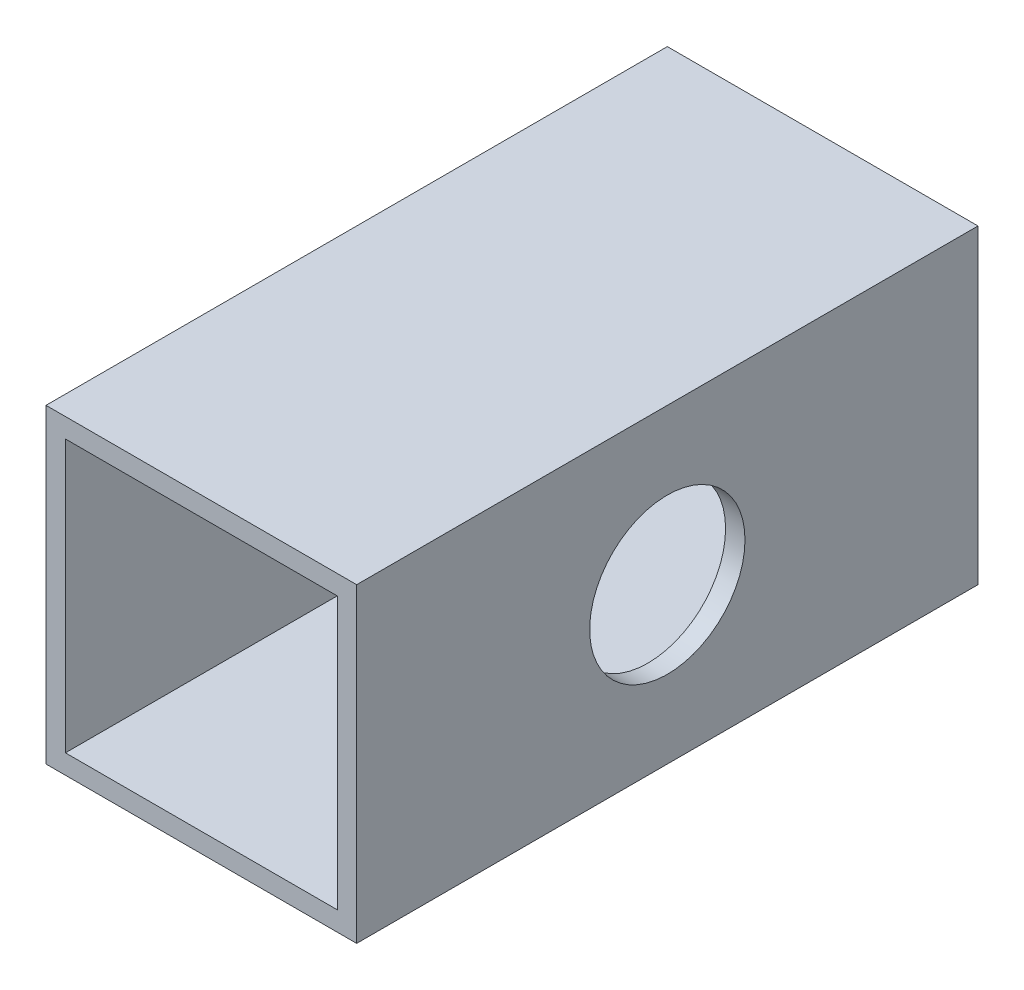
ISO-10303-21;
HEADER;
FILE_DESCRIPTION(('STEP AP214'),'2;1');
FILE_NAME('part.step','',(''),(''),'','','');
FILE_SCHEMA(('AUTOMOTIVE_DESIGN { 1 0 10303 214 1 1 1 1 }'));
ENDSEC;
DATA;
#1=APPLICATION_CONTEXT('core data for automotive mechanical design processes');
#2=APPLICATION_PROTOCOL_DEFINITION('international standard','automotive_design',2000,#1);
#3=PRODUCT_CONTEXT('',#1,'mechanical');
#4=PRODUCT('Part','Part','',(#3));
#5=PRODUCT_RELATED_PRODUCT_CATEGORY('part','',(#4));
#6=PRODUCT_DEFINITION_FORMATION('','',#4);
#7=PRODUCT_DEFINITION_CONTEXT('part definition',#1,'design');
#8=PRODUCT_DEFINITION('design','',#6,#7);
#9=PRODUCT_DEFINITION_SHAPE('','',#8);
#10=(LENGTH_UNIT() NAMED_UNIT(*) SI_UNIT(.MILLI.,.METRE.));
#11=(NAMED_UNIT(*) PLANE_ANGLE_UNIT() SI_UNIT($,.RADIAN.));
#12=(NAMED_UNIT(*) SI_UNIT($,.STERADIAN.) SOLID_ANGLE_UNIT());
#13=UNCERTAINTY_MEASURE_WITH_UNIT(LENGTH_MEASURE(1.E-05),#10,'distance_accuracy_value','');
#14=(GEOMETRIC_REPRESENTATION_CONTEXT(3) GLOBAL_UNCERTAINTY_ASSIGNED_CONTEXT((#13)) GLOBAL_UNIT_ASSIGNED_CONTEXT((#10,
#11,#12)) REPRESENTATION_CONTEXT('',''));
#15=CARTESIAN_POINT('',(0.,0.,0.));
#16=DIRECTION('',(0.,0.,1.));
#17=DIRECTION('',(1.,0.,0.));
#18=AXIS2_PLACEMENT_3D('',#15,#16,#17);
#19=CARTESIAN_POINT('',(0.,0.,50.8));
#20=DIRECTION('',(0.,0.,-1.));
#21=DIRECTION('',(-1.,0.,0.));
#22=AXIS2_PLACEMENT_3D('',#19,#20,#21);
#23=PLANE('',#22);
#24=DIRECTION('',(0.,1.,0.));
#25=VECTOR('',#24,1.);
#26=CARTESIAN_POINT('',(12.7,-12.7,50.8));
#27=LINE('',#26,#25);
#28=CARTESIAN_POINT('',(12.7,-12.7,50.8));
#29=VERTEX_POINT('',#28);
#30=CARTESIAN_POINT('',(12.7,12.7,50.8));
#31=VERTEX_POINT('',#30);
#32=EDGE_CURVE('E137',#29,#31,#27,.T.);
#33=ORIENTED_EDGE('',*,*,#32,.T.);
#34=DIRECTION('',(-1.,0.,0.));
#35=VECTOR('',#34,1.);
#36=CARTESIAN_POINT('',(-12.7,12.7,50.8));
#37=LINE('',#36,#35);
#38=CARTESIAN_POINT('',(-12.7,12.7,50.8));
#39=VERTEX_POINT('',#38);
#40=EDGE_CURVE('E140',#31,#39,#37,.T.);
#41=ORIENTED_EDGE('',*,*,#40,.T.);
#42=DIRECTION('',(0.,-1.,0.));
#43=VECTOR('',#42,1.);
#44=CARTESIAN_POINT('',(-12.7,-12.7,50.8));
#45=LINE('',#44,#43);
#46=CARTESIAN_POINT('',(-12.7,-12.7,50.8));
#47=VERTEX_POINT('',#46);
#48=EDGE_CURVE('E143',#39,#47,#45,.T.);
#49=ORIENTED_EDGE('',*,*,#48,.T.);
#50=DIRECTION('',(1.,0.,0.));
#51=VECTOR('',#50,1.);
#52=CARTESIAN_POINT('',(-12.7,-12.7,50.8));
#53=LINE('',#52,#51);
#54=EDGE_CURVE('E145',#47,#29,#53,.T.);
#55=ORIENTED_EDGE('',*,*,#54,.T.);
#56=EDGE_LOOP('',(#33,#41,#49,#55));
#57=FACE_BOUND('',#56,.T.);
#58=DIRECTION('',(0.,1.,0.));
#59=VECTOR('',#58,1.);
#60=CARTESIAN_POINT('',(11.1125,-11.1125,50.8));
#61=LINE('',#60,#59);
#62=CARTESIAN_POINT('',(11.1125,-11.1125,50.8));
#63=VERTEX_POINT('',#62);
#64=CARTESIAN_POINT('',(11.1125,11.1125,50.8));
#65=VERTEX_POINT('',#64);
#66=EDGE_CURVE('E99',#63,#65,#61,.T.);
#67=ORIENTED_EDGE('',*,*,#66,.F.);
#68=DIRECTION('',(1.,0.,0.));
#69=VECTOR('',#68,1.);
#70=CARTESIAN_POINT('',(-11.1125,-11.1125,50.8));
#71=LINE('',#70,#69);
#72=CARTESIAN_POINT('',(-11.1125,-11.1125,50.8));
#73=VERTEX_POINT('',#72);
#74=EDGE_CURVE('E121',#73,#63,#71,.T.);
#75=ORIENTED_EDGE('',*,*,#74,.F.);
#76=DIRECTION('',(0.,-1.,0.));
#77=VECTOR('',#76,1.);
#78=CARTESIAN_POINT('',(-11.1125,-11.1125,50.8));
#79=LINE('',#78,#77);
#80=CARTESIAN_POINT('',(-11.1125,11.1125,50.8));
#81=VERTEX_POINT('',#80);
#82=EDGE_CURVE('E119',#81,#73,#79,.T.);
#83=ORIENTED_EDGE('',*,*,#82,.F.);
#84=DIRECTION('',(-1.,0.,0.));
#85=VECTOR('',#84,1.);
#86=CARTESIAN_POINT('',(-11.1125,11.1125,50.8));
#87=LINE('',#86,#85);
#88=EDGE_CURVE('E107',#65,#81,#87,.T.);
#89=ORIENTED_EDGE('',*,*,#88,.F.);
#90=EDGE_LOOP('',(#67,#75,#83,#89));
#91=FACE_BOUND('',#90,.T.);
#92=ADVANCED_FACE('F33',(#57,#91),#23,.F.);
#93=CARTESIAN_POINT('',(0.,0.,0.));
#94=DIRECTION('',(0.,0.,-1.));
#95=DIRECTION('',(-1.,0.,0.));
#96=AXIS2_PLACEMENT_3D('',#93,#94,#95);
#97=PLANE('',#96);
#98=DIRECTION('',(0.,1.,0.));
#99=VECTOR('',#98,1.);
#100=CARTESIAN_POINT('',(12.7,-12.7,0.));
#101=LINE('',#100,#99);
#102=CARTESIAN_POINT('',(12.7,-12.7,0.));
#103=VERTEX_POINT('',#102);
#104=CARTESIAN_POINT('',(12.7,12.7,0.));
#105=VERTEX_POINT('',#104);
#106=EDGE_CURVE('E115',#103,#105,#101,.T.);
#107=ORIENTED_EDGE('',*,*,#106,.F.);
#108=DIRECTION('',(1.,0.,0.));
#109=VECTOR('',#108,1.);
#110=CARTESIAN_POINT('',(-12.7,-12.7,0.));
#111=LINE('',#110,#109);
#112=CARTESIAN_POINT('',(-12.7,-12.7,0.));
#113=VERTEX_POINT('',#112);
#114=EDGE_CURVE('E141',#113,#103,#111,.T.);
#115=ORIENTED_EDGE('',*,*,#114,.F.);
#116=DIRECTION('',(0.,-1.,0.));
#117=VECTOR('',#116,1.);
#118=CARTESIAN_POINT('',(-12.7,-12.7,0.));
#119=LINE('',#118,#117);
#120=CARTESIAN_POINT('',(-12.7,12.7,0.));
#121=VERTEX_POINT('',#120);
#122=EDGE_CURVE('E152',#121,#113,#119,.T.);
#123=ORIENTED_EDGE('',*,*,#122,.F.);
#124=DIRECTION('',(-1.,0.,0.));
#125=VECTOR('',#124,1.);
#126=CARTESIAN_POINT('',(-12.7,12.7,0.));
#127=LINE('',#126,#125);
#128=EDGE_CURVE('E150',#105,#121,#127,.T.);
#129=ORIENTED_EDGE('',*,*,#128,.F.);
#130=EDGE_LOOP('',(#107,#115,#123,#129));
#131=FACE_BOUND('',#130,.T.);
#132=DIRECTION('',(1.,0.,0.));
#133=VECTOR('',#132,1.);
#134=CARTESIAN_POINT('',(-11.1125,-11.1125,0.));
#135=LINE('',#134,#133);
#136=CARTESIAN_POINT('',(-11.1125,-11.1125,0.));
#137=VERTEX_POINT('',#136);
#138=CARTESIAN_POINT('',(11.1125,-11.1125,0.));
#139=VERTEX_POINT('',#138);
#140=EDGE_CURVE('E108',#137,#139,#135,.T.);
#141=ORIENTED_EDGE('',*,*,#140,.T.);
#142=DIRECTION('',(0.,1.,0.));
#143=VECTOR('',#142,1.);
#144=CARTESIAN_POINT('',(11.1125,-11.1125,0.));
#145=LINE('',#144,#143);
#146=CARTESIAN_POINT('',(11.1125,11.1125,0.));
#147=VERTEX_POINT('',#146);
#148=EDGE_CURVE('E57',#139,#147,#145,.T.);
#149=ORIENTED_EDGE('',*,*,#148,.T.);
#150=DIRECTION('',(-1.,0.,0.));
#151=VECTOR('',#150,1.);
#152=CARTESIAN_POINT('',(-11.1125,11.1125,0.));
#153=LINE('',#152,#151);
#154=CARTESIAN_POINT('',(-11.1125,11.1125,0.));
#155=VERTEX_POINT('',#154);
#156=EDGE_CURVE('E114',#147,#155,#153,.T.);
#157=ORIENTED_EDGE('',*,*,#156,.T.);
#158=DIRECTION('',(0.,-1.,0.));
#159=VECTOR('',#158,1.);
#160=CARTESIAN_POINT('',(-11.1125,-11.1125,0.));
#161=LINE('',#160,#159);
#162=EDGE_CURVE('E129',#155,#137,#161,.T.);
#163=ORIENTED_EDGE('',*,*,#162,.T.);
#164=EDGE_LOOP('',(#141,#149,#157,#163));
#165=FACE_BOUND('',#164,.T.);
#166=ADVANCED_FACE('F171',(#131,#165),#97,.T.);
#167=CARTESIAN_POINT('',(12.7,-12.7,50.8));
#168=DIRECTION('',(-1.,0.,0.));
#169=DIRECTION('',(0.,0.,1.));
#170=AXIS2_PLACEMENT_3D('',#167,#168,#169);
#171=PLANE('',#170);
#172=CARTESIAN_POINT('',(12.7,0.,25.4));
#173=DIRECTION('',(1.,0.,0.));
#174=DIRECTION('',(0.,0.,-1.));
#175=AXIS2_PLACEMENT_3D('',#172,#173,#174);
#176=CIRCLE('',#175,6.35);
#177=CARTESIAN_POINT('',(12.7,0.,19.05));
#178=VERTEX_POINT('',#177);
#179=EDGE_CURVE('E214',#178,#178,#176,.T.);
#180=ORIENTED_EDGE('',*,*,#179,.F.);
#181=EDGE_LOOP('',(#180));
#182=FACE_BOUND('',#181,.T.);
#183=ORIENTED_EDGE('',*,*,#106,.T.);
#184=DIRECTION('',(0.,0.,-1.));
#185=VECTOR('',#184,1.);
#186=CARTESIAN_POINT('',(12.7,12.7,50.8));
#187=LINE('',#186,#185);
#188=EDGE_CURVE('E11',#31,#105,#187,.T.);
#189=ORIENTED_EDGE('',*,*,#188,.F.);
#190=ORIENTED_EDGE('',*,*,#32,.F.);
#191=DIRECTION('',(0.,0.,-1.));
#192=VECTOR('',#191,1.);
#193=CARTESIAN_POINT('',(12.7,-12.7,50.8));
#194=LINE('',#193,#192);
#195=EDGE_CURVE('E147',#29,#103,#194,.T.);
#196=ORIENTED_EDGE('',*,*,#195,.T.);
#197=EDGE_LOOP('',(#183,#189,#190,#196));
#198=FACE_BOUND('',#197,.T.);
#199=ADVANCED_FACE('F35',(#182,#198),#171,.F.);
#200=CARTESIAN_POINT('',(-12.7,12.7,50.8));
#201=DIRECTION('',(0.,-1.,0.));
#202=DIRECTION('',(0.,0.,-1.));
#203=AXIS2_PLACEMENT_3D('',#200,#201,#202);
#204=PLANE('',#203);
#205=ORIENTED_EDGE('',*,*,#128,.T.);
#206=DIRECTION('',(0.,0.,-1.));
#207=VECTOR('',#206,1.);
#208=CARTESIAN_POINT('',(-12.7,12.7,50.8));
#209=LINE('',#208,#207);
#210=EDGE_CURVE('E42',#39,#121,#209,.T.);
#211=ORIENTED_EDGE('',*,*,#210,.F.);
#212=ORIENTED_EDGE('',*,*,#40,.F.);
#213=ORIENTED_EDGE('',*,*,#188,.T.);
#214=EDGE_LOOP('',(#205,#211,#212,#213));
#215=FACE_BOUND('',#214,.T.);
#216=ADVANCED_FACE('F181',(#215),#204,.F.);
#217=CARTESIAN_POINT('',(-12.7,-12.7,50.8));
#218=DIRECTION('',(1.,0.,0.));
#219=DIRECTION('',(0.,1.,0.));
#220=AXIS2_PLACEMENT_3D('',#217,#218,#219);
#221=PLANE('',#220);
#222=CARTESIAN_POINT('',(-12.7,0.,25.4));
#223=DIRECTION('',(1.,0.,0.));
#224=DIRECTION('',(0.,0.,-1.));
#225=AXIS2_PLACEMENT_3D('',#222,#223,#224);
#226=CIRCLE('',#225,6.35);
#227=CARTESIAN_POINT('',(-12.7,0.,19.05));
#228=VERTEX_POINT('',#227);
#229=EDGE_CURVE('E212',#228,#228,#226,.T.);
#230=ORIENTED_EDGE('',*,*,#229,.T.);
#231=EDGE_LOOP('',(#230));
#232=FACE_BOUND('',#231,.T.);
#233=ORIENTED_EDGE('',*,*,#122,.T.);
#234=DIRECTION('',(0.,0.,-1.));
#235=VECTOR('',#234,1.);
#236=CARTESIAN_POINT('',(-12.7,-12.7,50.8));
#237=LINE('',#236,#235);
#238=EDGE_CURVE('E157',#47,#113,#237,.T.);
#239=ORIENTED_EDGE('',*,*,#238,.F.);
#240=ORIENTED_EDGE('',*,*,#48,.F.);
#241=ORIENTED_EDGE('',*,*,#210,.T.);
#242=EDGE_LOOP('',(#233,#239,#240,#241));
#243=FACE_BOUND('',#242,.T.);
#244=ADVANCED_FACE('F165',(#232,#243),#221,.F.);
#245=CARTESIAN_POINT('',(-12.7,-12.7,50.8));
#246=DIRECTION('',(0.,1.,0.));
#247=DIRECTION('',(0.,0.,1.));
#248=AXIS2_PLACEMENT_3D('',#245,#246,#247);
#249=PLANE('',#248);
#250=ORIENTED_EDGE('',*,*,#114,.T.);
#251=ORIENTED_EDGE('',*,*,#195,.F.);
#252=ORIENTED_EDGE('',*,*,#54,.F.);
#253=ORIENTED_EDGE('',*,*,#238,.T.);
#254=EDGE_LOOP('',(#250,#251,#252,#253));
#255=FACE_BOUND('',#254,.T.);
#256=ADVANCED_FACE('F175',(#255),#249,.F.);
#257=CARTESIAN_POINT('',(11.1125,-11.1125,50.8));
#258=DIRECTION('',(-1.,0.,0.));
#259=DIRECTION('',(0.,0.,1.));
#260=AXIS2_PLACEMENT_3D('',#257,#258,#259);
#261=PLANE('',#260);
#262=CARTESIAN_POINT('',(11.1125,0.,25.4));
#263=DIRECTION('',(-1.,0.,0.));
#264=DIRECTION('',(0.,0.,1.));
#265=AXIS2_PLACEMENT_3D('',#262,#263,#264);
#266=CIRCLE('',#265,6.35);
#267=CARTESIAN_POINT('',(11.1125,0.,31.75));
#268=VERTEX_POINT('',#267);
#269=EDGE_CURVE('E127',#268,#268,#266,.T.);
#270=ORIENTED_EDGE('',*,*,#269,.F.);
#271=EDGE_LOOP('',(#270));
#272=FACE_BOUND('',#271,.T.);
#273=ORIENTED_EDGE('',*,*,#148,.F.);
#274=DIRECTION('',(0.,0.,-1.));
#275=VECTOR('',#274,1.);
#276=CARTESIAN_POINT('',(11.1125,-11.1125,50.8));
#277=LINE('',#276,#275);
#278=EDGE_CURVE('E103',#63,#139,#277,.T.);
#279=ORIENTED_EDGE('',*,*,#278,.F.);
#280=ORIENTED_EDGE('',*,*,#66,.T.);
#281=DIRECTION('',(0.,0.,-1.));
#282=VECTOR('',#281,1.);
#283=CARTESIAN_POINT('',(11.1125,11.1125,50.8));
#284=LINE('',#283,#282);
#285=EDGE_CURVE('E102',#65,#147,#284,.T.);
#286=ORIENTED_EDGE('',*,*,#285,.T.);
#287=EDGE_LOOP('',(#273,#279,#280,#286));
#288=FACE_BOUND('',#287,.T.);
#289=ADVANCED_FACE('F101',(#272,#288),#261,.T.);
#290=CARTESIAN_POINT('',(-11.1125,11.1125,50.8));
#291=DIRECTION('',(0.,-1.,0.));
#292=DIRECTION('',(0.,0.,-1.));
#293=AXIS2_PLACEMENT_3D('',#290,#291,#292);
#294=PLANE('',#293);
#295=ORIENTED_EDGE('',*,*,#156,.F.);
#296=ORIENTED_EDGE('',*,*,#285,.F.);
#297=ORIENTED_EDGE('',*,*,#88,.T.);
#298=DIRECTION('',(0.,0.,-1.));
#299=VECTOR('',#298,1.);
#300=CARTESIAN_POINT('',(-11.1125,11.1125,50.8));
#301=LINE('',#300,#299);
#302=EDGE_CURVE('E116',#81,#155,#301,.T.);
#303=ORIENTED_EDGE('',*,*,#302,.T.);
#304=EDGE_LOOP('',(#295,#296,#297,#303));
#305=FACE_BOUND('',#304,.T.);
#306=ADVANCED_FACE('F111',(#305),#294,.T.);
#307=CARTESIAN_POINT('',(-11.1125,-11.1125,50.8));
#308=DIRECTION('',(1.,0.,0.));
#309=DIRECTION('',(0.,0.,-1.));
#310=AXIS2_PLACEMENT_3D('',#307,#308,#309);
#311=PLANE('',#310);
#312=CARTESIAN_POINT('',(-11.1125,0.,25.4));
#313=DIRECTION('',(1.,0.,0.));
#314=DIRECTION('',(0.,0.,-1.));
#315=AXIS2_PLACEMENT_3D('',#312,#313,#314);
#316=CIRCLE('',#315,6.35);
#317=CARTESIAN_POINT('',(-11.1125,0.,19.05));
#318=VERTEX_POINT('',#317);
#319=EDGE_CURVE('E37',#318,#318,#316,.T.);
#320=ORIENTED_EDGE('',*,*,#319,.F.);
#321=EDGE_LOOP('',(#320));
#322=FACE_BOUND('',#321,.T.);
#323=ORIENTED_EDGE('',*,*,#162,.F.);
#324=ORIENTED_EDGE('',*,*,#302,.F.);
#325=ORIENTED_EDGE('',*,*,#82,.T.);
#326=DIRECTION('',(0.,0.,-1.));
#327=VECTOR('',#326,1.);
#328=CARTESIAN_POINT('',(-11.1125,-11.1125,50.8));
#329=LINE('',#328,#327);
#330=EDGE_CURVE('E49',#73,#137,#329,.T.);
#331=ORIENTED_EDGE('',*,*,#330,.T.);
#332=EDGE_LOOP('',(#323,#324,#325,#331));
#333=FACE_BOUND('',#332,.T.);
#334=ADVANCED_FACE('F207',(#322,#333),#311,.T.);
#335=CARTESIAN_POINT('',(-11.1125,-11.1125,50.8));
#336=DIRECTION('',(0.,1.,0.));
#337=DIRECTION('',(0.,0.,1.));
#338=AXIS2_PLACEMENT_3D('',#335,#336,#337);
#339=PLANE('',#338);
#340=ORIENTED_EDGE('',*,*,#140,.F.);
#341=ORIENTED_EDGE('',*,*,#330,.F.);
#342=ORIENTED_EDGE('',*,*,#74,.T.);
#343=ORIENTED_EDGE('',*,*,#278,.T.);
#344=EDGE_LOOP('',(#340,#341,#342,#343));
#345=FACE_BOUND('',#344,.T.);
#346=ADVANCED_FACE('F223',(#345),#339,.T.);
#347=CARTESIAN_POINT('',(-12.7,0.,25.4));
#348=DIRECTION('',(1.,0.,0.));
#349=DIRECTION('',(0.,0.,-1.));
#350=AXIS2_PLACEMENT_3D('',#347,#348,#349);
#351=CYLINDRICAL_SURFACE('',#350,6.35);
#352=ORIENTED_EDGE('',*,*,#319,.T.);
#353=EDGE_LOOP('',(#352));
#354=FACE_BOUND('',#353,.T.);
#355=ORIENTED_EDGE('',*,*,#229,.F.);
#356=EDGE_LOOP('',(#355));
#357=FACE_BOUND('',#356,.T.);
#358=ADVANCED_FACE('F220',(#354,#357),#351,.F.);
#359=ORIENTED_EDGE('',*,*,#269,.T.);
#360=EDGE_LOOP('',(#359));
#361=FACE_BOUND('',#360,.T.);
#362=ORIENTED_EDGE('',*,*,#179,.T.);
#363=EDGE_LOOP('',(#362));
#364=FACE_BOUND('',#363,.T.);
#365=ADVANCED_FACE('F222',(#361,#364),#351,.F.);
#366=CLOSED_SHELL('',(#92,#166,#199,#216,#244,#256,#289,#306,#334,#346,#358,#365));
#367=MANIFOLD_SOLID_BREP('B2',#366);
#368=ADVANCED_BREP_SHAPE_REPRESENTATION('',(#18,#367),#14);
#369=SHAPE_DEFINITION_REPRESENTATION(#9,#368);
ENDSEC;
END-ISO-10303-21;
